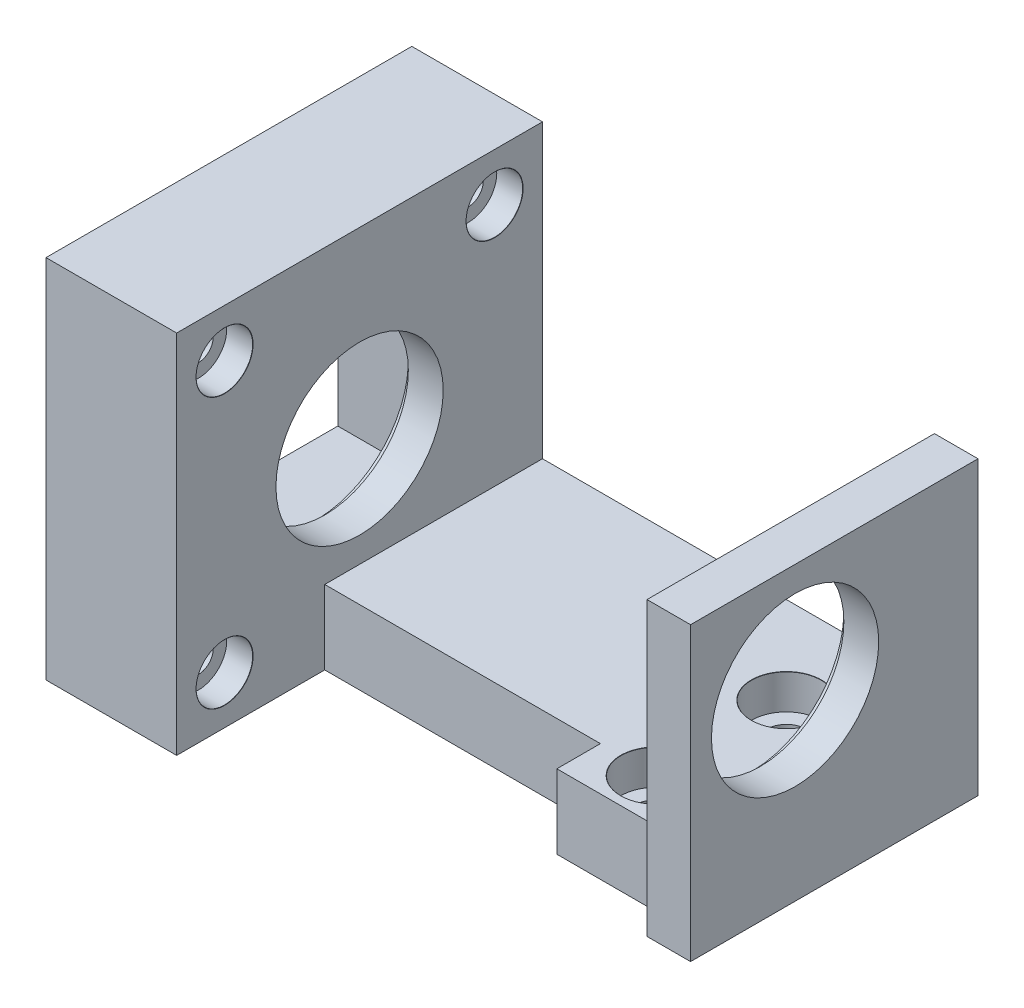
ISO-10303-21;
HEADER;
FILE_DESCRIPTION(('STEP AP214'),'2;1');
FILE_NAME('part.step','',(''),(''),'','','');
FILE_SCHEMA(('AUTOMOTIVE_DESIGN { 1 0 10303 214 1 1 1 1 }'));
ENDSEC;
DATA;
#1=APPLICATION_CONTEXT('core data for automotive mechanical design processes');
#2=APPLICATION_PROTOCOL_DEFINITION('international standard','automotive_design',2000,#1);
#3=PRODUCT_CONTEXT('',#1,'mechanical');
#4=PRODUCT('Part','Part','',(#3));
#5=PRODUCT_RELATED_PRODUCT_CATEGORY('part','',(#4));
#6=PRODUCT_DEFINITION_FORMATION('','',#4);
#7=PRODUCT_DEFINITION_CONTEXT('part definition',#1,'design');
#8=PRODUCT_DEFINITION('design','',#6,#7);
#9=PRODUCT_DEFINITION_SHAPE('','',#8);
#10=(LENGTH_UNIT() NAMED_UNIT(*) SI_UNIT(.MILLI.,.METRE.));
#11=(NAMED_UNIT(*) PLANE_ANGLE_UNIT() SI_UNIT($,.RADIAN.));
#12=(NAMED_UNIT(*) SI_UNIT($,.STERADIAN.) SOLID_ANGLE_UNIT());
#13=UNCERTAINTY_MEASURE_WITH_UNIT(LENGTH_MEASURE(1.E-05),#10,'distance_accuracy_value','');
#14=(GEOMETRIC_REPRESENTATION_CONTEXT(3) GLOBAL_UNCERTAINTY_ASSIGNED_CONTEXT((#13)) GLOBAL_UNIT_ASSIGNED_CONTEXT((#10,
#11,#12)) REPRESENTATION_CONTEXT('',''));
#15=CARTESIAN_POINT('',(0.,0.,0.));
#16=DIRECTION('',(0.,0.,1.));
#17=DIRECTION('',(1.,0.,0.));
#18=AXIS2_PLACEMENT_3D('',#15,#16,#17);
#19=CARTESIAN_POINT('',(0.,5.,0.));
#20=DIRECTION('',(0.,-1.,0.));
#21=DIRECTION('',(0.,0.,-1.));
#22=AXIS2_PLACEMENT_3D('',#19,#20,#21);
#23=PLANE('',#22);
#24=CARTESIAN_POINT('',(15.5,5.,8.5));
#25=DIRECTION('',(0.,1.,0.));
#26=DIRECTION('',(0.,0.,1.));
#27=AXIS2_PLACEMENT_3D('',#24,#25,#26);
#28=CIRCLE('',#27,4.025);
#29=CARTESIAN_POINT('',(15.5,5.,12.525));
#30=VERTEX_POINT('',#29);
#31=EDGE_CURVE('E333',#30,#30,#28,.T.);
#32=ORIENTED_EDGE('',*,*,#31,.F.);
#33=EDGE_LOOP('',(#32));
#34=FACE_BOUND('',#33,.T.);
#35=CARTESIAN_POINT('',(15.5,5.,-6.5));
#36=DIRECTION('',(0.,1.,0.));
#37=DIRECTION('',(0.,0.,1.));
#38=AXIS2_PLACEMENT_3D('',#35,#36,#37);
#39=CIRCLE('',#38,4.025);
#40=CARTESIAN_POINT('',(15.5,5.,-2.475));
#41=VERTEX_POINT('',#40);
#42=EDGE_CURVE('E348',#41,#41,#39,.T.);
#43=ORIENTED_EDGE('',*,*,#42,.F.);
#44=EDGE_LOOP('',(#43));
#45=FACE_BOUND('',#44,.T.);
#46=DIRECTION('',(0.,0.,1.));
#47=VECTOR('',#46,1.);
#48=CARTESIAN_POINT('',(22.5,5.,-7.5));
#49=LINE('',#48,#47);
#50=CARTESIAN_POINT('',(22.5,5.,-16.5));
#51=VERTEX_POINT('',#50);
#52=CARTESIAN_POINT('',(22.5,5.,13.5));
#53=VERTEX_POINT('',#52);
#54=EDGE_CURVE('E152',#51,#53,#49,.T.);
#55=ORIENTED_EDGE('',*,*,#54,.F.);
#56=DIRECTION('',(-1.,0.,0.));
#57=VECTOR('',#56,1.);
#58=CARTESIAN_POINT('',(-27.5,5.,-16.5));
#59=LINE('',#58,#57);
#60=CARTESIAN_POINT('',(-22.5,5.,-16.5));
#61=VERTEX_POINT('',#60);
#62=EDGE_CURVE('E156',#51,#61,#59,.T.);
#63=ORIENTED_EDGE('',*,*,#62,.T.);
#64=DIRECTION('',(0.,0.,-1.));
#65=VECTOR('',#64,1.);
#66=CARTESIAN_POINT('',(-22.5,5.,-7.5));
#67=LINE('',#66,#65);
#68=CARTESIAN_POINT('',(-22.5,5.,8.5));
#69=VERTEX_POINT('',#68);
#70=EDGE_CURVE('E162',#69,#61,#67,.T.);
#71=ORIENTED_EDGE('',*,*,#70,.F.);
#72=DIRECTION('',(-1.,0.,0.));
#73=VECTOR('',#72,1.);
#74=CARTESIAN_POINT('',(-22.5,5.,8.5));
#75=LINE('',#74,#73);
#76=CARTESIAN_POINT('',(9.15000000000001,5.,8.5));
#77=VERTEX_POINT('',#76);
#78=EDGE_CURVE('E360',#77,#69,#75,.T.);
#79=ORIENTED_EDGE('',*,*,#78,.F.);
#80=DIRECTION('',(0.,0.,-1.));
#81=VECTOR('',#80,1.);
#82=CARTESIAN_POINT('',(9.15000000000001,5.,8.5));
#83=LINE('',#82,#81);
#84=CARTESIAN_POINT('',(9.15000000000001,5.,13.5));
#85=VERTEX_POINT('',#84);
#86=EDGE_CURVE('E364',#85,#77,#83,.T.);
#87=ORIENTED_EDGE('',*,*,#86,.F.);
#88=DIRECTION('',(-1.,0.,0.));
#89=VECTOR('',#88,1.);
#90=CARTESIAN_POINT('',(9.15000000000001,5.,13.5));
#91=LINE('',#90,#89);
#92=EDGE_CURVE('E160',#53,#85,#91,.T.);
#93=ORIENTED_EDGE('',*,*,#92,.F.);
#94=EDGE_LOOP('',(#55,#63,#71,#79,#87,#93));
#95=FACE_BOUND('',#94,.T.);
#96=ADVANCED_FACE('F39',(#34,#45,#95),#23,.F.);
#97=CARTESIAN_POINT('',(-22.5,30.,-7.5));
#98=DIRECTION('',(-1.,0.,0.));
#99=DIRECTION('',(0.,0.,1.));
#100=AXIS2_PLACEMENT_3D('',#97,#98,#99);
#101=PLANE('',#100);
#102=DIRECTION('',(0.,1.,0.));
#103=VECTOR('',#102,1.);
#104=CARTESIAN_POINT('',(-22.5,-3.50000000000001,8.5));
#105=LINE('',#104,#103);
#106=CARTESIAN_POINT('',(-22.5,-3.50000000000001,8.5));
#107=VERTEX_POINT('',#106);
#108=EDGE_CURVE('E351',#107,#69,#105,.T.);
#109=ORIENTED_EDGE('',*,*,#108,.T.);
#110=ORIENTED_EDGE('',*,*,#70,.T.);
#111=DIRECTION('',(0.,1.,0.));
#112=VECTOR('',#111,1.);
#113=CARTESIAN_POINT('',(-22.5,5.,-16.5));
#114=LINE('',#113,#112);
#115=CARTESIAN_POINT('',(-22.5,38.5,-16.5));
#116=VERTEX_POINT('',#115);
#117=EDGE_CURVE('E178',#61,#116,#114,.T.);
#118=ORIENTED_EDGE('',*,*,#117,.T.);
#119=DIRECTION('',(0.,0.,1.));
#120=VECTOR('',#119,1.);
#121=CARTESIAN_POINT('',(-22.5,38.5,-16.5));
#122=LINE('',#121,#120);
#123=CARTESIAN_POINT('',(-22.5,38.5,25.5));
#124=VERTEX_POINT('',#123);
#125=EDGE_CURVE('E214',#116,#124,#122,.T.);
#126=ORIENTED_EDGE('',*,*,#125,.T.);
#127=DIRECTION('',(0.,-1.,0.));
#128=VECTOR('',#127,1.);
#129=CARTESIAN_POINT('',(-22.5,38.5,25.5));
#130=LINE('',#129,#128);
#131=CARTESIAN_POINT('',(-22.5,-3.50000000000001,25.5));
#132=VERTEX_POINT('',#131);
#133=EDGE_CURVE('E216',#124,#132,#130,.T.);
#134=ORIENTED_EDGE('',*,*,#133,.T.);
#135=DIRECTION('',(0.,0.,-1.));
#136=VECTOR('',#135,1.);
#137=CARTESIAN_POINT('',(-22.5,-3.50000000000001,25.5));
#138=LINE('',#137,#136);
#139=EDGE_CURVE('E227',#132,#107,#138,.T.);
#140=ORIENTED_EDGE('',*,*,#139,.T.);
#141=EDGE_LOOP('',(#109,#110,#118,#126,#134,#140));
#142=FACE_BOUND('',#141,.T.);
#143=CARTESIAN_POINT('',(-22.5,17.5,4.5));
#144=DIRECTION('',(-1.,0.,0.));
#145=DIRECTION('',(0.,0.,1.));
#146=AXIS2_PLACEMENT_3D('',#143,#144,#145);
#147=CIRCLE('',#146,9.60000000000001);
#148=CARTESIAN_POINT('',(-22.5,17.5,14.1));
#149=VERTEX_POINT('',#148);
#150=EDGE_CURVE('E190',#149,#149,#147,.T.);
#151=ORIENTED_EDGE('',*,*,#150,.T.);
#152=EDGE_LOOP('',(#151));
#153=FACE_BOUND('',#152,.T.);
#154=CARTESIAN_POINT('',(-22.5,1.99999999999999,20.));
#155=DIRECTION('',(1.,0.,0.));
#156=DIRECTION('',(0.,0.,-1.));
#157=AXIS2_PLACEMENT_3D('',#154,#155,#156);
#158=CIRCLE('',#157,3.275);
#159=CARTESIAN_POINT('',(-22.5,1.99999999999999,16.725));
#160=VERTEX_POINT('',#159);
#161=EDGE_CURVE('E282',#160,#160,#158,.T.);
#162=ORIENTED_EDGE('',*,*,#161,.F.);
#163=EDGE_LOOP('',(#162));
#164=FACE_BOUND('',#163,.T.);
#165=CARTESIAN_POINT('',(-22.5,33.,-11.));
#166=DIRECTION('',(1.,0.,0.));
#167=DIRECTION('',(0.,0.,-1.));
#168=AXIS2_PLACEMENT_3D('',#165,#166,#167);
#169=CIRCLE('',#168,3.275);
#170=CARTESIAN_POINT('',(-22.5,33.,-14.275));
#171=VERTEX_POINT('',#170);
#172=EDGE_CURVE('E297',#171,#171,#169,.T.);
#173=ORIENTED_EDGE('',*,*,#172,.F.);
#174=EDGE_LOOP('',(#173));
#175=FACE_BOUND('',#174,.T.);
#176=CARTESIAN_POINT('',(-22.5,33.,20.));
#177=DIRECTION('',(1.,0.,0.));
#178=DIRECTION('',(0.,0.,-1.));
#179=AXIS2_PLACEMENT_3D('',#176,#177,#178);
#180=CIRCLE('',#179,3.275);
#181=CARTESIAN_POINT('',(-22.5,33.,16.725));
#182=VERTEX_POINT('',#181);
#183=EDGE_CURVE('E312',#182,#182,#180,.T.);
#184=ORIENTED_EDGE('',*,*,#183,.F.);
#185=EDGE_LOOP('',(#184));
#186=FACE_BOUND('',#185,.T.);
#187=ADVANCED_FACE('F401',(#142,#153,#164,#175,#186),#101,.F.);
#188=CARTESIAN_POINT('',(-27.5,5.,16.5));
#189=DIRECTION('',(0.,0.,-1.));
#190=DIRECTION('',(-1.,0.,0.));
#191=AXIS2_PLACEMENT_3D('',#188,#189,#190);
#192=PLANE('',#191);
#193=DIRECTION('',(0.,-1.,0.));
#194=VECTOR('',#193,1.);
#195=CARTESIAN_POINT('',(22.5,30.,16.5));
#196=LINE('',#195,#194);
#197=CARTESIAN_POINT('',(22.5,30.,16.5));
#198=VERTEX_POINT('',#197);
#199=CARTESIAN_POINT('',(22.5,-3.50000000000001,16.5));
#200=VERTEX_POINT('',#199);
#201=EDGE_CURVE('E187',#198,#200,#196,.T.);
#202=ORIENTED_EDGE('',*,*,#201,.T.);
#203=DIRECTION('',(-1.,0.,0.));
#204=VECTOR('',#203,1.);
#205=CARTESIAN_POINT('',(-22.5,-3.5,16.5));
#206=LINE('',#205,#204);
#207=CARTESIAN_POINT('',(27.5,-3.5,16.5));
#208=VERTEX_POINT('',#207);
#209=EDGE_CURVE('E316',#208,#200,#206,.T.);
#210=ORIENTED_EDGE('',*,*,#209,.F.);
#211=DIRECTION('',(0.,-1.,0.));
#212=VECTOR('',#211,1.);
#213=CARTESIAN_POINT('',(27.5,5.,16.5));
#214=LINE('',#213,#212);
#215=CARTESIAN_POINT('',(27.5,30.,16.5));
#216=VERTEX_POINT('',#215);
#217=EDGE_CURVE('E47',#216,#208,#214,.T.);
#218=ORIENTED_EDGE('',*,*,#217,.F.);
#219=DIRECTION('',(1.,0.,0.));
#220=VECTOR('',#219,1.);
#221=CARTESIAN_POINT('',(27.5,30.,16.5));
#222=LINE('',#221,#220);
#223=EDGE_CURVE('E185',#198,#216,#222,.T.);
#224=ORIENTED_EDGE('',*,*,#223,.F.);
#225=EDGE_LOOP('',(#202,#210,#218,#224));
#226=FACE_BOUND('',#225,.T.);
#227=ADVANCED_FACE('F418',(#226),#192,.F.);
#228=CARTESIAN_POINT('',(-27.5,5.,16.5));
#229=DIRECTION('',(1.,0.,0.));
#230=DIRECTION('',(0.,0.,-1.));
#231=AXIS2_PLACEMENT_3D('',#228,#229,#230);
#232=PLANE('',#231);
#233=DIRECTION('',(0.,0.,-1.));
#234=VECTOR('',#233,1.);
#235=CARTESIAN_POINT('',(-27.5,30.,-8.00000000000001));
#236=LINE('',#235,#234);
#237=CARTESIAN_POINT('',(-27.5,30.,17.));
#238=VERTEX_POINT('',#237);
#239=CARTESIAN_POINT('',(-27.5,30.,-8.00000000000001));
#240=VERTEX_POINT('',#239);
#241=EDGE_CURVE('E250',#238,#240,#236,.T.);
#242=ORIENTED_EDGE('',*,*,#241,.T.);
#243=DIRECTION('',(0.,-1.,0.));
#244=VECTOR('',#243,1.);
#245=CARTESIAN_POINT('',(-27.5,30.,-8.00000000000001));
#246=LINE('',#245,#244);
#247=CARTESIAN_POINT('',(-27.5,4.99999999999999,-8.00000000000001));
#248=VERTEX_POINT('',#247);
#249=EDGE_CURVE('E260',#240,#248,#246,.T.);
#250=ORIENTED_EDGE('',*,*,#249,.T.);
#251=DIRECTION('',(0.,0.,1.));
#252=VECTOR('',#251,1.);
#253=CARTESIAN_POINT('',(-27.5,4.99999999999999,-8.00000000000001));
#254=LINE('',#253,#252);
#255=CARTESIAN_POINT('',(-27.5,4.99999999999999,17.));
#256=VERTEX_POINT('',#255);
#257=EDGE_CURVE('E257',#248,#256,#254,.T.);
#258=ORIENTED_EDGE('',*,*,#257,.T.);
#259=DIRECTION('',(0.,1.,0.));
#260=VECTOR('',#259,1.);
#261=CARTESIAN_POINT('',(-27.5,30.,17.));
#262=LINE('',#261,#260);
#263=EDGE_CURVE('E254',#256,#238,#262,.T.);
#264=ORIENTED_EDGE('',*,*,#263,.T.);
#265=EDGE_LOOP('',(#242,#250,#258,#264));
#266=FACE_BOUND('',#265,.T.);
#267=CARTESIAN_POINT('',(-27.5,17.5,4.5));
#268=DIRECTION('',(-1.,0.,0.));
#269=DIRECTION('',(0.,0.,1.));
#270=AXIS2_PLACEMENT_3D('',#267,#268,#269);
#271=CIRCLE('',#270,10.6);
#272=CARTESIAN_POINT('',(-27.5,17.5,15.1));
#273=VERTEX_POINT('',#272);
#274=EDGE_CURVE('E199',#273,#273,#271,.T.);
#275=ORIENTED_EDGE('',*,*,#274,.F.);
#276=EDGE_LOOP('',(#275));
#277=FACE_BOUND('',#276,.T.);
#278=ADVANCED_FACE('F420',(#266,#277),#232,.F.);
#279=CARTESIAN_POINT('',(27.5,5.,16.5));
#280=DIRECTION('',(-1.,0.,0.));
#281=DIRECTION('',(0.,0.,1.));
#282=AXIS2_PLACEMENT_3D('',#279,#280,#281);
#283=PLANE('',#282);
#284=DIRECTION('',(0.,-1.,0.));
#285=VECTOR('',#284,1.);
#286=CARTESIAN_POINT('',(27.5,5.,-16.5));
#287=LINE('',#286,#285);
#288=CARTESIAN_POINT('',(27.5,30.,-16.5));
#289=VERTEX_POINT('',#288);
#290=CARTESIAN_POINT('',(27.5,-3.5,-16.5));
#291=VERTEX_POINT('',#290);
#292=EDGE_CURVE('E11',#289,#291,#287,.T.);
#293=ORIENTED_EDGE('',*,*,#292,.F.);
#294=DIRECTION('',(0.,0.,-1.));
#295=VECTOR('',#294,1.);
#296=CARTESIAN_POINT('',(27.5,30.,-7.5));
#297=LINE('',#296,#295);
#298=EDGE_CURVE('E163',#216,#289,#297,.T.);
#299=ORIENTED_EDGE('',*,*,#298,.F.);
#300=ORIENTED_EDGE('',*,*,#217,.T.);
#301=DIRECTION('',(0.,0.,1.));
#302=VECTOR('',#301,1.);
#303=CARTESIAN_POINT('',(27.5,-3.5,16.5));
#304=LINE('',#303,#302);
#305=EDGE_CURVE('E315',#291,#208,#304,.T.);
#306=ORIENTED_EDGE('',*,*,#305,.F.);
#307=EDGE_LOOP('',(#293,#299,#300,#306));
#308=FACE_BOUND('',#307,.T.);
#309=CARTESIAN_POINT('',(27.5,17.5,4.5));
#310=DIRECTION('',(-1.,0.,0.));
#311=DIRECTION('',(0.,0.,1.));
#312=AXIS2_PLACEMENT_3D('',#309,#310,#311);
#313=CIRCLE('',#312,9.60000000000001);
#314=CARTESIAN_POINT('',(27.5,17.5,14.1));
#315=VERTEX_POINT('',#314);
#316=EDGE_CURVE('E202',#315,#315,#313,.T.);
#317=ORIENTED_EDGE('',*,*,#316,.T.);
#318=EDGE_LOOP('',(#317));
#319=FACE_BOUND('',#318,.T.);
#320=ADVANCED_FACE('F41',(#308,#319),#283,.F.);
#321=CARTESIAN_POINT('',(-27.5,5.,-16.5));
#322=DIRECTION('',(0.,0.,1.));
#323=DIRECTION('',(1.,0.,0.));
#324=AXIS2_PLACEMENT_3D('',#321,#322,#323);
#325=PLANE('',#324);
#326=ORIENTED_EDGE('',*,*,#292,.T.);
#327=DIRECTION('',(-1.,0.,0.));
#328=VECTOR('',#327,1.);
#329=CARTESIAN_POINT('',(36.89696961967,-3.50000000000001,-16.5));
#330=LINE('',#329,#328);
#331=CARTESIAN_POINT('',(-37.5,-3.50000000000001,-16.5));
#332=VERTEX_POINT('',#331);
#333=EDGE_CURVE('E222',#291,#332,#330,.T.);
#334=ORIENTED_EDGE('',*,*,#333,.T.);
#335=DIRECTION('',(0.,-1.,0.));
#336=VECTOR('',#335,1.);
#337=CARTESIAN_POINT('',(-37.5,38.5,-16.5));
#338=LINE('',#337,#336);
#339=CARTESIAN_POINT('',(-37.5,38.5,-16.5));
#340=VERTEX_POINT('',#339);
#341=EDGE_CURVE('E238',#340,#332,#338,.T.);
#342=ORIENTED_EDGE('',*,*,#341,.F.);
#343=DIRECTION('',(-1.,0.,0.));
#344=VECTOR('',#343,1.);
#345=CARTESIAN_POINT('',(36.89696961967,38.5,-16.5));
#346=LINE('',#345,#344);
#347=EDGE_CURVE('E219',#116,#340,#346,.T.);
#348=ORIENTED_EDGE('',*,*,#347,.F.);
#349=ORIENTED_EDGE('',*,*,#117,.F.);
#350=ORIENTED_EDGE('',*,*,#62,.F.);
#351=DIRECTION('',(0.,-1.,0.));
#352=VECTOR('',#351,1.);
#353=CARTESIAN_POINT('',(22.5,40.295630140987,-16.5));
#354=LINE('',#353,#352);
#355=CARTESIAN_POINT('',(22.5,30.,-16.5));
#356=VERTEX_POINT('',#355);
#357=EDGE_CURVE('E166',#356,#51,#354,.T.);
#358=ORIENTED_EDGE('',*,*,#357,.F.);
#359=DIRECTION('',(1.,0.,0.));
#360=VECTOR('',#359,1.);
#361=CARTESIAN_POINT('',(27.5,30.,-16.5));
#362=LINE('',#361,#360);
#363=EDGE_CURVE('E173',#356,#289,#362,.T.);
#364=ORIENTED_EDGE('',*,*,#363,.T.);
#365=EDGE_LOOP('',(#326,#334,#342,#348,#349,#350,#358,#364));
#366=FACE_BOUND('',#365,.T.);
#367=ADVANCED_FACE('F176',(#366),#325,.F.);
#368=CARTESIAN_POINT('',(22.5,30.,-7.5));
#369=DIRECTION('',(1.,0.,0.));
#370=DIRECTION('',(0.,0.,-1.));
#371=AXIS2_PLACEMENT_3D('',#368,#369,#370);
#372=PLANE('',#371);
#373=CARTESIAN_POINT('',(22.5,17.5,4.5));
#374=DIRECTION('',(-1.,0.,0.));
#375=DIRECTION('',(0.,0.,1.));
#376=AXIS2_PLACEMENT_3D('',#373,#374,#375);
#377=CIRCLE('',#376,10.6);
#378=CARTESIAN_POINT('',(22.5,17.5,15.1));
#379=VERTEX_POINT('',#378);
#380=EDGE_CURVE('E211',#379,#379,#377,.T.);
#381=ORIENTED_EDGE('',*,*,#380,.F.);
#382=EDGE_LOOP('',(#381));
#383=FACE_BOUND('',#382,.T.);
#384=ORIENTED_EDGE('',*,*,#54,.T.);
#385=DIRECTION('',(0.,1.,0.));
#386=VECTOR('',#385,1.);
#387=CARTESIAN_POINT('',(22.5,-3.50000000000001,13.5));
#388=LINE('',#387,#386);
#389=CARTESIAN_POINT('',(22.5,-3.50000000000001,13.5));
#390=VERTEX_POINT('',#389);
#391=EDGE_CURVE('E352',#390,#53,#388,.T.);
#392=ORIENTED_EDGE('',*,*,#391,.F.);
#393=DIRECTION('',(0.,0.,-1.));
#394=VECTOR('',#393,1.);
#395=CARTESIAN_POINT('',(22.5,-3.50000000000001,16.5));
#396=LINE('',#395,#394);
#397=EDGE_CURVE('E363',#200,#390,#396,.T.);
#398=ORIENTED_EDGE('',*,*,#397,.F.);
#399=ORIENTED_EDGE('',*,*,#201,.F.);
#400=DIRECTION('',(0.,0.,1.));
#401=VECTOR('',#400,1.);
#402=CARTESIAN_POINT('',(22.5,30.,-7.5));
#403=LINE('',#402,#401);
#404=EDGE_CURVE('E169',#356,#198,#403,.T.);
#405=ORIENTED_EDGE('',*,*,#404,.F.);
#406=ORIENTED_EDGE('',*,*,#357,.T.);
#407=EDGE_LOOP('',(#384,#392,#398,#399,#405,#406));
#408=FACE_BOUND('',#407,.T.);
#409=ADVANCED_FACE('F167',(#383,#408),#372,.F.);
#410=CARTESIAN_POINT('',(0.,30.,0.));
#411=DIRECTION('',(0.,-1.,0.));
#412=DIRECTION('',(0.,0.,-1.));
#413=AXIS2_PLACEMENT_3D('',#410,#411,#412);
#414=PLANE('',#413);
#415=ORIENTED_EDGE('',*,*,#298,.T.);
#416=ORIENTED_EDGE('',*,*,#363,.F.);
#417=ORIENTED_EDGE('',*,*,#404,.T.);
#418=ORIENTED_EDGE('',*,*,#223,.T.);
#419=EDGE_LOOP('',(#415,#416,#417,#418));
#420=FACE_BOUND('',#419,.T.);
#421=ADVANCED_FACE('F378',(#420),#414,.F.);
#422=CARTESIAN_POINT('',(-27.5,17.5,4.5));
#423=DIRECTION('',(-1.,0.,0.));
#424=DIRECTION('',(0.,0.,1.));
#425=AXIS2_PLACEMENT_3D('',#422,#423,#424);
#426=CYLINDRICAL_SURFACE('',#425,9.60000000000001);
#427=ORIENTED_EDGE('',*,*,#150,.F.);
#428=EDGE_LOOP('',(#427));
#429=FACE_BOUND('',#428,.T.);
#430=CARTESIAN_POINT('',(-26.5,17.5,4.5));
#431=DIRECTION('',(-1.,0.,0.));
#432=DIRECTION('',(0.,0.,1.));
#433=AXIS2_PLACEMENT_3D('',#430,#431,#432);
#434=CIRCLE('',#433,9.60000000000001);
#435=CARTESIAN_POINT('',(-26.5,17.5,14.1));
#436=VERTEX_POINT('',#435);
#437=EDGE_CURVE('E193',#436,#436,#434,.T.);
#438=ORIENTED_EDGE('',*,*,#437,.T.);
#439=EDGE_LOOP('',(#438));
#440=FACE_BOUND('',#439,.T.);
#441=ADVANCED_FACE('F442',(#429,#440),#426,.F.);
#442=CARTESIAN_POINT('',(-26.5,27.1,4.5));
#443=DIRECTION('',(1.,0.,0.));
#444=DIRECTION('',(0.,0.,-1.));
#445=AXIS2_PLACEMENT_3D('',#442,#443,#444);
#446=PLANE('',#445);
#447=ORIENTED_EDGE('',*,*,#437,.F.);
#448=EDGE_LOOP('',(#447));
#449=FACE_BOUND('',#448,.T.);
#450=CARTESIAN_POINT('',(-26.5,17.5,4.5));
#451=DIRECTION('',(-1.,0.,0.));
#452=DIRECTION('',(0.,0.,1.));
#453=AXIS2_PLACEMENT_3D('',#450,#451,#452);
#454=CIRCLE('',#453,10.6);
#455=CARTESIAN_POINT('',(-26.5,17.5,15.1));
#456=VERTEX_POINT('',#455);
#457=EDGE_CURVE('E196',#456,#456,#454,.T.);
#458=ORIENTED_EDGE('',*,*,#457,.T.);
#459=EDGE_LOOP('',(#458));
#460=FACE_BOUND('',#459,.T.);
#461=ADVANCED_FACE('F448',(#449,#460),#446,.F.);
#462=CARTESIAN_POINT('',(-27.5,17.5,4.5));
#463=DIRECTION('',(-1.,0.,0.));
#464=DIRECTION('',(0.,0.,1.));
#465=AXIS2_PLACEMENT_3D('',#462,#463,#464);
#466=CYLINDRICAL_SURFACE('',#465,10.6);
#467=ORIENTED_EDGE('',*,*,#457,.F.);
#468=EDGE_LOOP('',(#467));
#469=FACE_BOUND('',#468,.T.);
#470=ORIENTED_EDGE('',*,*,#274,.T.);
#471=EDGE_LOOP('',(#470));
#472=FACE_BOUND('',#471,.T.);
#473=ADVANCED_FACE('F452',(#469,#472),#466,.F.);
#474=CARTESIAN_POINT('',(22.5,17.5,4.5));
#475=DIRECTION('',(-1.,0.,0.));
#476=DIRECTION('',(0.,0.,1.));
#477=AXIS2_PLACEMENT_3D('',#474,#475,#476);
#478=CYLINDRICAL_SURFACE('',#477,9.60000000000001);
#479=ORIENTED_EDGE('',*,*,#316,.F.);
#480=EDGE_LOOP('',(#479));
#481=FACE_BOUND('',#480,.T.);
#482=CARTESIAN_POINT('',(23.5,17.5,4.5));
#483=DIRECTION('',(-1.,0.,0.));
#484=DIRECTION('',(0.,0.,1.));
#485=AXIS2_PLACEMENT_3D('',#482,#483,#484);
#486=CIRCLE('',#485,9.60000000000001);
#487=CARTESIAN_POINT('',(23.5,17.5,14.1));
#488=VERTEX_POINT('',#487);
#489=EDGE_CURVE('E205',#488,#488,#486,.T.);
#490=ORIENTED_EDGE('',*,*,#489,.T.);
#491=EDGE_LOOP('',(#490));
#492=FACE_BOUND('',#491,.T.);
#493=ADVANCED_FACE('F456',(#481,#492),#478,.F.);
#494=CARTESIAN_POINT('',(23.5,27.1,4.5));
#495=DIRECTION('',(1.,0.,0.));
#496=DIRECTION('',(0.,0.,-1.));
#497=AXIS2_PLACEMENT_3D('',#494,#495,#496);
#498=PLANE('',#497);
#499=ORIENTED_EDGE('',*,*,#489,.F.);
#500=EDGE_LOOP('',(#499));
#501=FACE_BOUND('',#500,.T.);
#502=CARTESIAN_POINT('',(23.5,17.5,4.5));
#503=DIRECTION('',(-1.,0.,0.));
#504=DIRECTION('',(0.,0.,1.));
#505=AXIS2_PLACEMENT_3D('',#502,#503,#504);
#506=CIRCLE('',#505,10.6);
#507=CARTESIAN_POINT('',(23.5,17.5,15.1));
#508=VERTEX_POINT('',#507);
#509=EDGE_CURVE('E208',#508,#508,#506,.T.);
#510=ORIENTED_EDGE('',*,*,#509,.T.);
#511=EDGE_LOOP('',(#510));
#512=FACE_BOUND('',#511,.T.);
#513=ADVANCED_FACE('F460',(#501,#512),#498,.F.);
#514=CARTESIAN_POINT('',(22.5,17.5,4.5));
#515=DIRECTION('',(-1.,0.,0.));
#516=DIRECTION('',(0.,0.,1.));
#517=AXIS2_PLACEMENT_3D('',#514,#515,#516);
#518=CYLINDRICAL_SURFACE('',#517,10.6);
#519=ORIENTED_EDGE('',*,*,#509,.F.);
#520=EDGE_LOOP('',(#519));
#521=FACE_BOUND('',#520,.T.);
#522=ORIENTED_EDGE('',*,*,#380,.T.);
#523=EDGE_LOOP('',(#522));
#524=FACE_BOUND('',#523,.T.);
#525=ADVANCED_FACE('F464',(#521,#524),#518,.F.);
#526=CARTESIAN_POINT('',(36.89696961967,38.5,25.5));
#527=DIRECTION('',(0.,0.,1.));
#528=DIRECTION('',(0.,-1.,0.));
#529=AXIS2_PLACEMENT_3D('',#526,#527,#528);
#530=PLANE('',#529);
#531=ORIENTED_EDGE('',*,*,#133,.F.);
#532=DIRECTION('',(-1.,0.,0.));
#533=VECTOR('',#532,1.);
#534=CARTESIAN_POINT('',(36.89696961967,38.5,25.5));
#535=LINE('',#534,#533);
#536=CARTESIAN_POINT('',(-37.5,38.5,25.5));
#537=VERTEX_POINT('',#536);
#538=EDGE_CURVE('E217',#124,#537,#535,.T.);
#539=ORIENTED_EDGE('',*,*,#538,.T.);
#540=DIRECTION('',(0.,1.,0.));
#541=VECTOR('',#540,1.);
#542=CARTESIAN_POINT('',(-37.5,38.5,25.5));
#543=LINE('',#542,#541);
#544=CARTESIAN_POINT('',(-37.5,-3.50000000000001,25.5));
#545=VERTEX_POINT('',#544);
#546=EDGE_CURVE('E232',#545,#537,#543,.T.);
#547=ORIENTED_EDGE('',*,*,#546,.F.);
#548=DIRECTION('',(-1.,0.,0.));
#549=VECTOR('',#548,1.);
#550=CARTESIAN_POINT('',(36.89696961967,-3.50000000000001,25.5));
#551=LINE('',#550,#549);
#552=EDGE_CURVE('E224',#132,#545,#551,.T.);
#553=ORIENTED_EDGE('',*,*,#552,.F.);
#554=EDGE_LOOP('',(#531,#539,#547,#553));
#555=FACE_BOUND('',#554,.T.);
#556=ADVANCED_FACE('F406',(#555),#530,.T.);
#557=CARTESIAN_POINT('',(36.89696961967,-3.50000000000001,25.5));
#558=DIRECTION('',(0.,-1.,0.));
#559=DIRECTION('',(0.,0.,-1.));
#560=AXIS2_PLACEMENT_3D('',#557,#558,#559);
#561=PLANE('',#560);
#562=DIRECTION('',(-1.,0.,0.));
#563=VECTOR('',#562,1.);
#564=CARTESIAN_POINT('',(-22.5,-3.50000000000001,8.5));
#565=LINE('',#564,#563);
#566=CARTESIAN_POINT('',(9.15000000000001,-3.50000000000001,8.5));
#567=VERTEX_POINT('',#566);
#568=EDGE_CURVE('E355',#567,#107,#565,.T.);
#569=ORIENTED_EDGE('',*,*,#568,.T.);
#570=ORIENTED_EDGE('',*,*,#139,.F.);
#571=ORIENTED_EDGE('',*,*,#552,.T.);
#572=DIRECTION('',(0.,0.,1.));
#573=VECTOR('',#572,1.);
#574=CARTESIAN_POINT('',(-37.5,-3.50000000000001,-16.5));
#575=LINE('',#574,#573);
#576=EDGE_CURVE('E235',#332,#545,#575,.T.);
#577=ORIENTED_EDGE('',*,*,#576,.F.);
#578=ORIENTED_EDGE('',*,*,#333,.F.);
#579=ORIENTED_EDGE('',*,*,#305,.T.);
#580=ORIENTED_EDGE('',*,*,#209,.T.);
#581=ORIENTED_EDGE('',*,*,#397,.T.);
#582=DIRECTION('',(-1.,0.,0.));
#583=VECTOR('',#582,1.);
#584=CARTESIAN_POINT('',(9.15000000000001,-3.50000000000001,13.5));
#585=LINE('',#584,#583);
#586=CARTESIAN_POINT('',(9.15000000000001,-3.50000000000001,13.5));
#587=VERTEX_POINT('',#586);
#588=EDGE_CURVE('E54',#390,#587,#585,.T.);
#589=ORIENTED_EDGE('',*,*,#588,.T.);
#590=DIRECTION('',(0.,0.,-1.));
#591=VECTOR('',#590,1.);
#592=CARTESIAN_POINT('',(9.15000000000001,-3.50000000000001,8.5));
#593=LINE('',#592,#591);
#594=EDGE_CURVE('E370',#587,#567,#593,.T.);
#595=ORIENTED_EDGE('',*,*,#594,.T.);
#596=EDGE_LOOP('',(#569,#570,#571,#577,#578,#579,#580,#581,#589,#595));
#597=FACE_BOUND('',#596,.T.);
#598=CARTESIAN_POINT('',(15.5,-3.50000000000001,-6.5));
#599=DIRECTION('',(0.,1.,0.));
#600=DIRECTION('',(0.,0.,1.));
#601=AXIS2_PLACEMENT_3D('',#598,#599,#600);
#602=CIRCLE('',#601,2.25);
#603=CARTESIAN_POINT('',(15.5,-3.50000000000001,-4.25));
#604=VERTEX_POINT('',#603);
#605=EDGE_CURVE('E336',#604,#604,#602,.T.);
#606=ORIENTED_EDGE('',*,*,#605,.T.);
#607=EDGE_LOOP('',(#606));
#608=FACE_BOUND('',#607,.T.);
#609=CARTESIAN_POINT('',(15.5,-3.50000000000001,8.5));
#610=DIRECTION('',(0.,1.,0.));
#611=DIRECTION('',(0.,0.,1.));
#612=AXIS2_PLACEMENT_3D('',#609,#610,#611);
#613=CIRCLE('',#612,2.25);
#614=CARTESIAN_POINT('',(15.5,-3.50000000000001,10.75));
#615=VERTEX_POINT('',#614);
#616=EDGE_CURVE('E319',#615,#615,#613,.T.);
#617=ORIENTED_EDGE('',*,*,#616,.T.);
#618=EDGE_LOOP('',(#617));
#619=FACE_BOUND('',#618,.T.);
#620=ADVANCED_FACE('F386',(#597,#608,#619),#561,.T.);
#621=CARTESIAN_POINT('',(36.89696961967,38.5,-16.5));
#622=DIRECTION('',(0.,1.,0.));
#623=DIRECTION('',(0.,0.,1.));
#624=AXIS2_PLACEMENT_3D('',#621,#622,#623);
#625=PLANE('',#624);
#626=ORIENTED_EDGE('',*,*,#125,.F.);
#627=ORIENTED_EDGE('',*,*,#347,.T.);
#628=DIRECTION('',(0.,0.,-1.));
#629=VECTOR('',#628,1.);
#630=CARTESIAN_POINT('',(-37.5,38.5,-16.5));
#631=LINE('',#630,#629);
#632=EDGE_CURVE('E220',#537,#340,#631,.T.);
#633=ORIENTED_EDGE('',*,*,#632,.F.);
#634=ORIENTED_EDGE('',*,*,#538,.F.);
#635=EDGE_LOOP('',(#626,#627,#633,#634));
#636=FACE_BOUND('',#635,.T.);
#637=ADVANCED_FACE('F398',(#636),#625,.T.);
#638=CARTESIAN_POINT('',(-37.5,0.,0.));
#639=DIRECTION('',(-1.,0.,0.));
#640=DIRECTION('',(0.,0.,1.));
#641=AXIS2_PLACEMENT_3D('',#638,#639,#640);
#642=PLANE('',#641);
#643=CARTESIAN_POINT('',(-37.5,33.,20.));
#644=DIRECTION('',(1.,0.,0.));
#645=DIRECTION('',(0.,0.,-1.));
#646=AXIS2_PLACEMENT_3D('',#643,#644,#645);
#647=CIRCLE('',#646,1.69999999999999);
#648=CARTESIAN_POINT('',(-37.5,33.,18.3));
#649=VERTEX_POINT('',#648);
#650=EDGE_CURVE('E300',#649,#649,#647,.T.);
#651=ORIENTED_EDGE('',*,*,#650,.T.);
#652=EDGE_LOOP('',(#651));
#653=FACE_BOUND('',#652,.T.);
#654=CARTESIAN_POINT('',(-37.5,33.,-11.));
#655=DIRECTION('',(1.,0.,0.));
#656=DIRECTION('',(0.,0.,-1.));
#657=AXIS2_PLACEMENT_3D('',#654,#655,#656);
#658=CIRCLE('',#657,1.69999999999999);
#659=CARTESIAN_POINT('',(-37.5,33.,-12.7));
#660=VERTEX_POINT('',#659);
#661=EDGE_CURVE('E285',#660,#660,#658,.T.);
#662=ORIENTED_EDGE('',*,*,#661,.T.);
#663=EDGE_LOOP('',(#662));
#664=FACE_BOUND('',#663,.T.);
#665=CARTESIAN_POINT('',(-37.5,1.99999999999999,20.));
#666=DIRECTION('',(1.,0.,0.));
#667=DIRECTION('',(0.,0.,-1.));
#668=AXIS2_PLACEMENT_3D('',#665,#666,#667);
#669=CIRCLE('',#668,1.69999999999999);
#670=CARTESIAN_POINT('',(-37.5,1.99999999999999,18.3));
#671=VERTEX_POINT('',#670);
#672=EDGE_CURVE('E263',#671,#671,#669,.T.);
#673=ORIENTED_EDGE('',*,*,#672,.T.);
#674=EDGE_LOOP('',(#673));
#675=FACE_BOUND('',#674,.T.);
#676=ORIENTED_EDGE('',*,*,#341,.T.);
#677=ORIENTED_EDGE('',*,*,#576,.T.);
#678=ORIENTED_EDGE('',*,*,#546,.T.);
#679=ORIENTED_EDGE('',*,*,#632,.T.);
#680=EDGE_LOOP('',(#676,#677,#678,#679));
#681=FACE_BOUND('',#680,.T.);
#682=DIRECTION('',(0.,0.,1.));
#683=VECTOR('',#682,1.);
#684=CARTESIAN_POINT('',(-37.5,4.99999999999999,-8.00000000000001));
#685=LINE('',#684,#683);
#686=CARTESIAN_POINT('',(-37.5,4.99999999999999,-8.00000000000001));
#687=VERTEX_POINT('',#686);
#688=CARTESIAN_POINT('',(-37.5,4.99999999999999,17.));
#689=VERTEX_POINT('',#688);
#690=EDGE_CURVE('E268',#687,#689,#685,.T.);
#691=ORIENTED_EDGE('',*,*,#690,.F.);
#692=DIRECTION('',(0.,-1.,0.));
#693=VECTOR('',#692,1.);
#694=CARTESIAN_POINT('',(-37.5,30.,-8.00000000000001));
#695=LINE('',#694,#693);
#696=CARTESIAN_POINT('',(-37.5,30.,-8.00000000000001));
#697=VERTEX_POINT('',#696);
#698=EDGE_CURVE('E253',#697,#687,#695,.T.);
#699=ORIENTED_EDGE('',*,*,#698,.F.);
#700=DIRECTION('',(0.,0.,-1.));
#701=VECTOR('',#700,1.);
#702=CARTESIAN_POINT('',(-37.5,30.,-8.00000000000001));
#703=LINE('',#702,#701);
#704=CARTESIAN_POINT('',(-37.5,30.,17.));
#705=VERTEX_POINT('',#704);
#706=EDGE_CURVE('E249',#705,#697,#703,.T.);
#707=ORIENTED_EDGE('',*,*,#706,.F.);
#708=DIRECTION('',(0.,1.,0.));
#709=VECTOR('',#708,1.);
#710=CARTESIAN_POINT('',(-37.5,30.,17.));
#711=LINE('',#710,#709);
#712=EDGE_CURVE('E265',#689,#705,#711,.T.);
#713=ORIENTED_EDGE('',*,*,#712,.F.);
#714=EDGE_LOOP('',(#691,#699,#707,#713));
#715=FACE_BOUND('',#714,.T.);
#716=ADVANCED_FACE('F392',(#653,#664,#675,#681,#715),#642,.T.);
#717=CARTESIAN_POINT('',(-37.5,30.,-8.00000000000001));
#718=DIRECTION('',(0.,0.,1.));
#719=DIRECTION('',(0.,-1.,0.));
#720=AXIS2_PLACEMENT_3D('',#717,#718,#719);
#721=PLANE('',#720);
#722=ORIENTED_EDGE('',*,*,#249,.F.);
#723=DIRECTION('',(1.,0.,0.));
#724=VECTOR('',#723,1.);
#725=CARTESIAN_POINT('',(-37.5,30.,-8.00000000000001));
#726=LINE('',#725,#724);
#727=EDGE_CURVE('E62',#697,#240,#726,.T.);
#728=ORIENTED_EDGE('',*,*,#727,.F.);
#729=ORIENTED_EDGE('',*,*,#698,.T.);
#730=DIRECTION('',(1.,0.,0.));
#731=VECTOR('',#730,1.);
#732=CARTESIAN_POINT('',(-37.5,4.99999999999999,-8.00000000000001));
#733=LINE('',#732,#731);
#734=EDGE_CURVE('E241',#687,#248,#733,.T.);
#735=ORIENTED_EDGE('',*,*,#734,.T.);
#736=EDGE_LOOP('',(#722,#728,#729,#735));
#737=FACE_BOUND('',#736,.T.);
#738=ADVANCED_FACE('F476',(#737),#721,.T.);
#739=CARTESIAN_POINT('',(-37.5,4.99999999999999,-8.00000000000001));
#740=DIRECTION('',(0.,1.,0.));
#741=DIRECTION('',(0.,0.,1.));
#742=AXIS2_PLACEMENT_3D('',#739,#740,#741);
#743=PLANE('',#742);
#744=ORIENTED_EDGE('',*,*,#257,.F.);
#745=ORIENTED_EDGE('',*,*,#734,.F.);
#746=ORIENTED_EDGE('',*,*,#690,.T.);
#747=DIRECTION('',(1.,0.,0.));
#748=VECTOR('',#747,1.);
#749=CARTESIAN_POINT('',(-37.5,4.99999999999999,17.));
#750=LINE('',#749,#748);
#751=EDGE_CURVE('E244',#689,#256,#750,.T.);
#752=ORIENTED_EDGE('',*,*,#751,.T.);
#753=EDGE_LOOP('',(#744,#745,#746,#752));
#754=FACE_BOUND('',#753,.T.);
#755=ADVANCED_FACE('F480',(#754),#743,.T.);
#756=CARTESIAN_POINT('',(-37.5,30.,17.));
#757=DIRECTION('',(0.,0.,-1.));
#758=DIRECTION('',(0.,1.,0.));
#759=AXIS2_PLACEMENT_3D('',#756,#757,#758);
#760=PLANE('',#759);
#761=ORIENTED_EDGE('',*,*,#263,.F.);
#762=ORIENTED_EDGE('',*,*,#751,.F.);
#763=ORIENTED_EDGE('',*,*,#712,.T.);
#764=DIRECTION('',(1.,0.,0.));
#765=VECTOR('',#764,1.);
#766=CARTESIAN_POINT('',(-37.5,30.,17.));
#767=LINE('',#766,#765);
#768=EDGE_CURVE('E246',#705,#238,#767,.T.);
#769=ORIENTED_EDGE('',*,*,#768,.T.);
#770=EDGE_LOOP('',(#761,#762,#763,#769));
#771=FACE_BOUND('',#770,.T.);
#772=ADVANCED_FACE('F484',(#771),#760,.T.);
#773=CARTESIAN_POINT('',(-37.5,30.,-8.00000000000001));
#774=DIRECTION('',(0.,-1.,0.));
#775=DIRECTION('',(0.,0.,-1.));
#776=AXIS2_PLACEMENT_3D('',#773,#774,#775);
#777=PLANE('',#776);
#778=ORIENTED_EDGE('',*,*,#241,.F.);
#779=ORIENTED_EDGE('',*,*,#768,.F.);
#780=ORIENTED_EDGE('',*,*,#706,.T.);
#781=ORIENTED_EDGE('',*,*,#727,.T.);
#782=EDGE_LOOP('',(#778,#779,#780,#781));
#783=FACE_BOUND('',#782,.T.);
#784=ADVANCED_FACE('F488',(#783),#777,.T.);
#785=CARTESIAN_POINT('',(-22.5,1.99999999999999,20.));
#786=DIRECTION('',(1.,0.,0.));
#787=DIRECTION('',(0.,0.,-1.));
#788=AXIS2_PLACEMENT_3D('',#785,#786,#787);
#789=CYLINDRICAL_SURFACE('',#788,1.7);
#790=ORIENTED_EDGE('',*,*,#672,.F.);
#791=EDGE_LOOP('',(#790));
#792=FACE_BOUND('',#791,.T.);
#793=CARTESIAN_POINT('',(-25.5,1.99999999999999,20.));
#794=DIRECTION('',(1.,0.,0.));
#795=DIRECTION('',(0.,0.,-1.));
#796=AXIS2_PLACEMENT_3D('',#793,#794,#795);
#797=CIRCLE('',#796,1.7);
#798=CARTESIAN_POINT('',(-25.5,1.99999999999999,18.3));
#799=VERTEX_POINT('',#798);
#800=EDGE_CURVE('E273',#799,#799,#797,.T.);
#801=ORIENTED_EDGE('',*,*,#800,.T.);
#802=EDGE_LOOP('',(#801));
#803=FACE_BOUND('',#802,.T.);
#804=ADVANCED_FACE('F492',(#792,#803),#789,.F.);
#805=CARTESIAN_POINT('',(-25.5,5.24999999999999,20.));
#806=DIRECTION('',(-1.,0.,0.));
#807=DIRECTION('',(0.,0.,1.));
#808=AXIS2_PLACEMENT_3D('',#805,#806,#807);
#809=PLANE('',#808);
#810=ORIENTED_EDGE('',*,*,#800,.F.);
#811=EDGE_LOOP('',(#810));
#812=FACE_BOUND('',#811,.T.);
#813=CARTESIAN_POINT('',(-25.5,1.99999999999999,20.));
#814=DIRECTION('',(1.,0.,0.));
#815=DIRECTION('',(0.,0.,-1.));
#816=AXIS2_PLACEMENT_3D('',#813,#814,#815);
#817=CIRCLE('',#816,3.25);
#818=CARTESIAN_POINT('',(-25.5,1.99999999999999,16.75));
#819=VERTEX_POINT('',#818);
#820=EDGE_CURVE('E276',#819,#819,#817,.T.);
#821=ORIENTED_EDGE('',*,*,#820,.T.);
#822=EDGE_LOOP('',(#821));
#823=FACE_BOUND('',#822,.T.);
#824=ADVANCED_FACE('F495',(#812,#823),#809,.F.);
#825=CARTESIAN_POINT('',(-22.5,1.99999999999999,20.));
#826=DIRECTION('',(1.,0.,0.));
#827=DIRECTION('',(0.,0.,-1.));
#828=AXIS2_PLACEMENT_3D('',#825,#826,#827);
#829=CYLINDRICAL_SURFACE('',#828,3.25);
#830=ORIENTED_EDGE('',*,*,#820,.F.);
#831=EDGE_LOOP('',(#830));
#832=FACE_BOUND('',#831,.T.);
#833=CARTESIAN_POINT('',(-22.5209774907794,1.99999999999999,20.));
#834=DIRECTION('',(1.,0.,0.));
#835=DIRECTION('',(0.,0.,-1.));
#836=AXIS2_PLACEMENT_3D('',#833,#834,#835);
#837=CIRCLE('',#836,3.25);
#838=CARTESIAN_POINT('',(-22.5209774907794,1.99999999999999,16.75));
#839=VERTEX_POINT('',#838);
#840=EDGE_CURVE('E279',#839,#839,#837,.T.);
#841=ORIENTED_EDGE('',*,*,#840,.T.);
#842=EDGE_LOOP('',(#841));
#843=FACE_BOUND('',#842,.T.);
#844=ADVANCED_FACE('F499',(#832,#843),#829,.F.);
#845=CARTESIAN_POINT('',(-22.5,1.99999999999999,20.));
#846=DIRECTION('',(1.,0.,0.));
#847=DIRECTION('',(0.,0.,-1.));
#848=AXIS2_PLACEMENT_3D('',#845,#846,#847);
#849=CONICAL_SURFACE('',#848,3.275,0.872664625997159);
#850=ORIENTED_EDGE('',*,*,#840,.F.);
#851=EDGE_LOOP('',(#850));
#852=FACE_BOUND('',#851,.T.);
#853=ORIENTED_EDGE('',*,*,#161,.T.);
#854=EDGE_LOOP('',(#853));
#855=FACE_BOUND('',#854,.T.);
#856=ADVANCED_FACE('F503',(#852,#855),#849,.F.);
#857=CARTESIAN_POINT('',(-22.5,33.,-11.));
#858=DIRECTION('',(1.,0.,0.));
#859=DIRECTION('',(0.,0.,-1.));
#860=AXIS2_PLACEMENT_3D('',#857,#858,#859);
#861=CYLINDRICAL_SURFACE('',#860,1.7);
#862=ORIENTED_EDGE('',*,*,#661,.F.);
#863=EDGE_LOOP('',(#862));
#864=FACE_BOUND('',#863,.T.);
#865=CARTESIAN_POINT('',(-25.5,33.,-11.));
#866=DIRECTION('',(1.,0.,0.));
#867=DIRECTION('',(0.,0.,-1.));
#868=AXIS2_PLACEMENT_3D('',#865,#866,#867);
#869=CIRCLE('',#868,1.7);
#870=CARTESIAN_POINT('',(-25.5,33.,-12.7));
#871=VERTEX_POINT('',#870);
#872=EDGE_CURVE('E288',#871,#871,#869,.T.);
#873=ORIENTED_EDGE('',*,*,#872,.T.);
#874=EDGE_LOOP('',(#873));
#875=FACE_BOUND('',#874,.T.);
#876=ADVANCED_FACE('F507',(#864,#875),#861,.F.);
#877=CARTESIAN_POINT('',(-25.5,36.25,-11.));
#878=DIRECTION('',(-1.,0.,0.));
#879=DIRECTION('',(0.,0.,1.));
#880=AXIS2_PLACEMENT_3D('',#877,#878,#879);
#881=PLANE('',#880);
#882=ORIENTED_EDGE('',*,*,#872,.F.);
#883=EDGE_LOOP('',(#882));
#884=FACE_BOUND('',#883,.T.);
#885=CARTESIAN_POINT('',(-25.5,33.,-11.));
#886=DIRECTION('',(1.,0.,0.));
#887=DIRECTION('',(0.,0.,-1.));
#888=AXIS2_PLACEMENT_3D('',#885,#886,#887);
#889=CIRCLE('',#888,3.25);
#890=CARTESIAN_POINT('',(-25.5,33.,-14.25));
#891=VERTEX_POINT('',#890);
#892=EDGE_CURVE('E291',#891,#891,#889,.T.);
#893=ORIENTED_EDGE('',*,*,#892,.T.);
#894=EDGE_LOOP('',(#893));
#895=FACE_BOUND('',#894,.T.);
#896=ADVANCED_FACE('F511',(#884,#895),#881,.F.);
#897=CARTESIAN_POINT('',(-22.5,33.,-11.));
#898=DIRECTION('',(1.,0.,0.));
#899=DIRECTION('',(0.,0.,-1.));
#900=AXIS2_PLACEMENT_3D('',#897,#898,#899);
#901=CYLINDRICAL_SURFACE('',#900,3.25);
#902=ORIENTED_EDGE('',*,*,#892,.F.);
#903=EDGE_LOOP('',(#902));
#904=FACE_BOUND('',#903,.T.);
#905=CARTESIAN_POINT('',(-22.5209774907794,33.,-11.));
#906=DIRECTION('',(1.,0.,0.));
#907=DIRECTION('',(0.,0.,-1.));
#908=AXIS2_PLACEMENT_3D('',#905,#906,#907);
#909=CIRCLE('',#908,3.25);
#910=CARTESIAN_POINT('',(-22.5209774907794,33.,-14.25));
#911=VERTEX_POINT('',#910);
#912=EDGE_CURVE('E294',#911,#911,#909,.T.);
#913=ORIENTED_EDGE('',*,*,#912,.T.);
#914=EDGE_LOOP('',(#913));
#915=FACE_BOUND('',#914,.T.);
#916=ADVANCED_FACE('F515',(#904,#915),#901,.F.);
#917=CARTESIAN_POINT('',(-22.5,33.,-11.));
#918=DIRECTION('',(1.,0.,0.));
#919=DIRECTION('',(0.,0.,-1.));
#920=AXIS2_PLACEMENT_3D('',#917,#918,#919);
#921=CONICAL_SURFACE('',#920,3.275,0.872664625997227);
#922=ORIENTED_EDGE('',*,*,#912,.F.);
#923=EDGE_LOOP('',(#922));
#924=FACE_BOUND('',#923,.T.);
#925=ORIENTED_EDGE('',*,*,#172,.T.);
#926=EDGE_LOOP('',(#925));
#927=FACE_BOUND('',#926,.T.);
#928=ADVANCED_FACE('F519',(#924,#927),#921,.F.);
#929=CARTESIAN_POINT('',(-22.5,33.,20.));
#930=DIRECTION('',(1.,0.,0.));
#931=DIRECTION('',(0.,0.,-1.));
#932=AXIS2_PLACEMENT_3D('',#929,#930,#931);
#933=CYLINDRICAL_SURFACE('',#932,1.7);
#934=ORIENTED_EDGE('',*,*,#650,.F.);
#935=EDGE_LOOP('',(#934));
#936=FACE_BOUND('',#935,.T.);
#937=CARTESIAN_POINT('',(-25.5,33.,20.));
#938=DIRECTION('',(1.,0.,0.));
#939=DIRECTION('',(0.,0.,-1.));
#940=AXIS2_PLACEMENT_3D('',#937,#938,#939);
#941=CIRCLE('',#940,1.7);
#942=CARTESIAN_POINT('',(-25.5,33.,18.3));
#943=VERTEX_POINT('',#942);
#944=EDGE_CURVE('E303',#943,#943,#941,.T.);
#945=ORIENTED_EDGE('',*,*,#944,.T.);
#946=EDGE_LOOP('',(#945));
#947=FACE_BOUND('',#946,.T.);
#948=ADVANCED_FACE('F523',(#936,#947),#933,.F.);
#949=CARTESIAN_POINT('',(-25.5,36.25,20.));
#950=DIRECTION('',(-1.,0.,0.));
#951=DIRECTION('',(0.,0.,1.));
#952=AXIS2_PLACEMENT_3D('',#949,#950,#951);
#953=PLANE('',#952);
#954=ORIENTED_EDGE('',*,*,#944,.F.);
#955=EDGE_LOOP('',(#954));
#956=FACE_BOUND('',#955,.T.);
#957=CARTESIAN_POINT('',(-25.5,33.,20.));
#958=DIRECTION('',(1.,0.,0.));
#959=DIRECTION('',(0.,0.,-1.));
#960=AXIS2_PLACEMENT_3D('',#957,#958,#959);
#961=CIRCLE('',#960,3.25);
#962=CARTESIAN_POINT('',(-25.5,33.,16.75));
#963=VERTEX_POINT('',#962);
#964=EDGE_CURVE('E306',#963,#963,#961,.T.);
#965=ORIENTED_EDGE('',*,*,#964,.T.);
#966=EDGE_LOOP('',(#965));
#967=FACE_BOUND('',#966,.T.);
#968=ADVANCED_FACE('F527',(#956,#967),#953,.F.);
#969=CARTESIAN_POINT('',(-22.5,33.,20.));
#970=DIRECTION('',(1.,0.,0.));
#971=DIRECTION('',(0.,0.,-1.));
#972=AXIS2_PLACEMENT_3D('',#969,#970,#971);
#973=CYLINDRICAL_SURFACE('',#972,3.25);
#974=ORIENTED_EDGE('',*,*,#964,.F.);
#975=EDGE_LOOP('',(#974));
#976=FACE_BOUND('',#975,.T.);
#977=CARTESIAN_POINT('',(-22.5209774907794,33.,20.));
#978=DIRECTION('',(1.,0.,0.));
#979=DIRECTION('',(0.,0.,-1.));
#980=AXIS2_PLACEMENT_3D('',#977,#978,#979);
#981=CIRCLE('',#980,3.25);
#982=CARTESIAN_POINT('',(-22.5209774907794,33.,16.75));
#983=VERTEX_POINT('',#982);
#984=EDGE_CURVE('E309',#983,#983,#981,.T.);
#985=ORIENTED_EDGE('',*,*,#984,.T.);
#986=EDGE_LOOP('',(#985));
#987=FACE_BOUND('',#986,.T.);
#988=ADVANCED_FACE('F531',(#976,#987),#973,.F.);
#989=CARTESIAN_POINT('',(-22.5,33.,20.));
#990=DIRECTION('',(1.,0.,0.));
#991=DIRECTION('',(0.,0.,-1.));
#992=AXIS2_PLACEMENT_3D('',#989,#990,#991);
#993=CONICAL_SURFACE('',#992,3.275,0.87266462599709);
#994=ORIENTED_EDGE('',*,*,#984,.F.);
#995=EDGE_LOOP('',(#994));
#996=FACE_BOUND('',#995,.T.);
#997=ORIENTED_EDGE('',*,*,#183,.T.);
#998=EDGE_LOOP('',(#997));
#999=FACE_BOUND('',#998,.T.);
#1000=ADVANCED_FACE('F535',(#996,#999),#993,.F.);
#1001=CARTESIAN_POINT('',(15.5,5.,8.5));
#1002=DIRECTION('',(0.,1.,0.));
#1003=DIRECTION('',(0.,0.,1.));
#1004=AXIS2_PLACEMENT_3D('',#1001,#1002,#1003);
#1005=CYLINDRICAL_SURFACE('',#1004,2.25);
#1006=ORIENTED_EDGE('',*,*,#616,.F.);
#1007=EDGE_LOOP('',(#1006));
#1008=FACE_BOUND('',#1007,.T.);
#1009=CARTESIAN_POINT('',(15.5,1.,8.5));
#1010=DIRECTION('',(0.,1.,0.));
#1011=DIRECTION('',(0.,0.,1.));
#1012=AXIS2_PLACEMENT_3D('',#1009,#1010,#1011);
#1013=CIRCLE('',#1012,2.25000000000001);
#1014=CARTESIAN_POINT('',(15.5,1.,10.75));
#1015=VERTEX_POINT('',#1014);
#1016=EDGE_CURVE('E324',#1015,#1015,#1013,.T.);
#1017=ORIENTED_EDGE('',*,*,#1016,.T.);
#1018=EDGE_LOOP('',(#1017));
#1019=FACE_BOUND('',#1018,.T.);
#1020=ADVANCED_FACE('F539',(#1008,#1019),#1005,.F.);
#1021=CARTESIAN_POINT('',(19.5,1.,8.5));
#1022=DIRECTION('',(0.,-1.,0.));
#1023=DIRECTION('',(0.,0.,-1.));
#1024=AXIS2_PLACEMENT_3D('',#1021,#1022,#1023);
#1025=PLANE('',#1024);
#1026=ORIENTED_EDGE('',*,*,#1016,.F.);
#1027=EDGE_LOOP('',(#1026));
#1028=FACE_BOUND('',#1027,.T.);
#1029=CARTESIAN_POINT('',(15.5,1.,8.5));
#1030=DIRECTION('',(0.,1.,0.));
#1031=DIRECTION('',(0.,0.,1.));
#1032=AXIS2_PLACEMENT_3D('',#1029,#1030,#1031);
#1033=CIRCLE('',#1032,4.);
#1034=CARTESIAN_POINT('',(15.5,1.,12.5));
#1035=VERTEX_POINT('',#1034);
#1036=EDGE_CURVE('E327',#1035,#1035,#1033,.T.);
#1037=ORIENTED_EDGE('',*,*,#1036,.T.);
#1038=EDGE_LOOP('',(#1037));
#1039=FACE_BOUND('',#1038,.T.);
#1040=ADVANCED_FACE('F543',(#1028,#1039),#1025,.F.);
#1041=CARTESIAN_POINT('',(15.5,5.,8.5));
#1042=DIRECTION('',(0.,1.,0.));
#1043=DIRECTION('',(0.,0.,1.));
#1044=AXIS2_PLACEMENT_3D('',#1041,#1042,#1043);
#1045=CYLINDRICAL_SURFACE('',#1044,4.);
#1046=ORIENTED_EDGE('',*,*,#1036,.F.);
#1047=EDGE_LOOP('',(#1046));
#1048=FACE_BOUND('',#1047,.T.);
#1049=CARTESIAN_POINT('',(15.5,4.97902250922057,8.5));
#1050=DIRECTION('',(0.,1.,0.));
#1051=DIRECTION('',(0.,0.,1.));
#1052=AXIS2_PLACEMENT_3D('',#1049,#1050,#1051);
#1053=CIRCLE('',#1052,4.);
#1054=CARTESIAN_POINT('',(15.5,4.97902250922057,12.5));
#1055=VERTEX_POINT('',#1054);
#1056=EDGE_CURVE('E330',#1055,#1055,#1053,.T.);
#1057=ORIENTED_EDGE('',*,*,#1056,.T.);
#1058=EDGE_LOOP('',(#1057));
#1059=FACE_BOUND('',#1058,.T.);
#1060=ADVANCED_FACE('F547',(#1048,#1059),#1045,.F.);
#1061=CARTESIAN_POINT('',(15.5,5.,8.5));
#1062=DIRECTION('',(0.,1.,0.));
#1063=DIRECTION('',(0.,0.,1.));
#1064=AXIS2_PLACEMENT_3D('',#1061,#1062,#1063);
#1065=CONICAL_SURFACE('',#1064,4.025,0.872664625997227);
#1066=ORIENTED_EDGE('',*,*,#1056,.F.);
#1067=EDGE_LOOP('',(#1066));
#1068=FACE_BOUND('',#1067,.T.);
#1069=ORIENTED_EDGE('',*,*,#31,.T.);
#1070=EDGE_LOOP('',(#1069));
#1071=FACE_BOUND('',#1070,.T.);
#1072=ADVANCED_FACE('F551',(#1068,#1071),#1065,.F.);
#1073=CARTESIAN_POINT('',(15.5,5.,-6.5));
#1074=DIRECTION('',(0.,1.,0.));
#1075=DIRECTION('',(0.,0.,1.));
#1076=AXIS2_PLACEMENT_3D('',#1073,#1074,#1075);
#1077=CYLINDRICAL_SURFACE('',#1076,2.25000000000001);
#1078=ORIENTED_EDGE('',*,*,#605,.F.);
#1079=EDGE_LOOP('',(#1078));
#1080=FACE_BOUND('',#1079,.T.);
#1081=CARTESIAN_POINT('',(15.5,1.,-6.5));
#1082=DIRECTION('',(0.,1.,0.));
#1083=DIRECTION('',(0.,0.,1.));
#1084=AXIS2_PLACEMENT_3D('',#1081,#1082,#1083);
#1085=CIRCLE('',#1084,2.25000000000001);
#1086=CARTESIAN_POINT('',(15.5,1.,-4.24999999999999));
#1087=VERTEX_POINT('',#1086);
#1088=EDGE_CURVE('E339',#1087,#1087,#1085,.T.);
#1089=ORIENTED_EDGE('',*,*,#1088,.T.);
#1090=EDGE_LOOP('',(#1089));
#1091=FACE_BOUND('',#1090,.T.);
#1092=ADVANCED_FACE('F555',(#1080,#1091),#1077,.F.);
#1093=CARTESIAN_POINT('',(19.5,1.,-6.5));
#1094=DIRECTION('',(0.,-1.,0.));
#1095=DIRECTION('',(0.,0.,-1.));
#1096=AXIS2_PLACEMENT_3D('',#1093,#1094,#1095);
#1097=PLANE('',#1096);
#1098=ORIENTED_EDGE('',*,*,#1088,.F.);
#1099=EDGE_LOOP('',(#1098));
#1100=FACE_BOUND('',#1099,.T.);
#1101=CARTESIAN_POINT('',(15.5,1.,-6.5));
#1102=DIRECTION('',(0.,1.,0.));
#1103=DIRECTION('',(0.,0.,1.));
#1104=AXIS2_PLACEMENT_3D('',#1101,#1102,#1103);
#1105=CIRCLE('',#1104,4.);
#1106=CARTESIAN_POINT('',(15.5,1.,-2.5));
#1107=VERTEX_POINT('',#1106);
#1108=EDGE_CURVE('E342',#1107,#1107,#1105,.T.);
#1109=ORIENTED_EDGE('',*,*,#1108,.T.);
#1110=EDGE_LOOP('',(#1109));
#1111=FACE_BOUND('',#1110,.T.);
#1112=ADVANCED_FACE('F559',(#1100,#1111),#1097,.F.);
#1113=CARTESIAN_POINT('',(15.5,5.,-6.5));
#1114=DIRECTION('',(0.,1.,0.));
#1115=DIRECTION('',(0.,0.,1.));
#1116=AXIS2_PLACEMENT_3D('',#1113,#1114,#1115);
#1117=CYLINDRICAL_SURFACE('',#1116,4.);
#1118=ORIENTED_EDGE('',*,*,#1108,.F.);
#1119=EDGE_LOOP('',(#1118));
#1120=FACE_BOUND('',#1119,.T.);
#1121=CARTESIAN_POINT('',(15.5,4.97902250922057,-6.5));
#1122=DIRECTION('',(0.,1.,0.));
#1123=DIRECTION('',(0.,0.,1.));
#1124=AXIS2_PLACEMENT_3D('',#1121,#1122,#1123);
#1125=CIRCLE('',#1124,4.);
#1126=CARTESIAN_POINT('',(15.5,4.97902250922057,-2.5));
#1127=VERTEX_POINT('',#1126);
#1128=EDGE_CURVE('E345',#1127,#1127,#1125,.T.);
#1129=ORIENTED_EDGE('',*,*,#1128,.T.);
#1130=EDGE_LOOP('',(#1129));
#1131=FACE_BOUND('',#1130,.T.);
#1132=ADVANCED_FACE('F563',(#1120,#1131),#1117,.F.);
#1133=CARTESIAN_POINT('',(15.5,5.,-6.5));
#1134=DIRECTION('',(0.,1.,0.));
#1135=DIRECTION('',(0.,0.,1.));
#1136=AXIS2_PLACEMENT_3D('',#1133,#1134,#1135);
#1137=CONICAL_SURFACE('',#1136,4.025,0.872664625997159);
#1138=ORIENTED_EDGE('',*,*,#1128,.F.);
#1139=EDGE_LOOP('',(#1138));
#1140=FACE_BOUND('',#1139,.T.);
#1141=ORIENTED_EDGE('',*,*,#42,.T.);
#1142=EDGE_LOOP('',(#1141));
#1143=FACE_BOUND('',#1142,.T.);
#1144=ADVANCED_FACE('F567',(#1140,#1143),#1137,.F.);
#1145=CARTESIAN_POINT('',(-22.5,-3.50000000000001,8.5));
#1146=DIRECTION('',(0.,0.,-1.));
#1147=DIRECTION('',(-1.,0.,0.));
#1148=AXIS2_PLACEMENT_3D('',#1145,#1146,#1147);
#1149=PLANE('',#1148);
#1150=ORIENTED_EDGE('',*,*,#78,.T.);
#1151=ORIENTED_EDGE('',*,*,#108,.F.);
#1152=ORIENTED_EDGE('',*,*,#568,.F.);
#1153=DIRECTION('',(0.,1.,0.));
#1154=VECTOR('',#1153,1.);
#1155=CARTESIAN_POINT('',(9.15000000000001,-3.50000000000001,8.5));
#1156=LINE('',#1155,#1154);
#1157=EDGE_CURVE('E357',#567,#77,#1156,.T.);
#1158=ORIENTED_EDGE('',*,*,#1157,.T.);
#1159=EDGE_LOOP('',(#1150,#1151,#1152,#1158));
#1160=FACE_BOUND('',#1159,.T.);
#1161=ADVANCED_FACE('F410',(#1160),#1149,.F.);
#1162=CARTESIAN_POINT('',(9.15000000000001,-3.50000000000001,8.5));
#1163=DIRECTION('',(1.,0.,0.));
#1164=DIRECTION('',(0.,0.,-1.));
#1165=AXIS2_PLACEMENT_3D('',#1162,#1163,#1164);
#1166=PLANE('',#1165);
#1167=ORIENTED_EDGE('',*,*,#86,.T.);
#1168=ORIENTED_EDGE('',*,*,#1157,.F.);
#1169=ORIENTED_EDGE('',*,*,#594,.F.);
#1170=DIRECTION('',(0.,1.,0.));
#1171=VECTOR('',#1170,1.);
#1172=CARTESIAN_POINT('',(9.15000000000001,-3.50000000000001,13.5));
#1173=LINE('',#1172,#1171);
#1174=EDGE_CURVE('E354',#587,#85,#1173,.T.);
#1175=ORIENTED_EDGE('',*,*,#1174,.T.);
#1176=EDGE_LOOP('',(#1167,#1168,#1169,#1175));
#1177=FACE_BOUND('',#1176,.T.);
#1178=ADVANCED_FACE('F413',(#1177),#1166,.F.);
#1179=CARTESIAN_POINT('',(9.15000000000001,-3.50000000000001,13.5));
#1180=DIRECTION('',(0.,0.,-1.));
#1181=DIRECTION('',(-1.,0.,0.));
#1182=AXIS2_PLACEMENT_3D('',#1179,#1180,#1181);
#1183=PLANE('',#1182);
#1184=ORIENTED_EDGE('',*,*,#92,.T.);
#1185=ORIENTED_EDGE('',*,*,#1174,.F.);
#1186=ORIENTED_EDGE('',*,*,#588,.F.);
#1187=ORIENTED_EDGE('',*,*,#391,.T.);
#1188=EDGE_LOOP('',(#1184,#1185,#1186,#1187));
#1189=FACE_BOUND('',#1188,.T.);
#1190=ADVANCED_FACE('F415',(#1189),#1183,.F.);
#1191=CLOSED_SHELL('',(#96,#187,#227,#278,#320,#367,#409,#421,#441,#461,#473,#493,#513,#525,
#556,#620,#637,#716,#738,#755,#772,#784,#804,#824,#844,#856,#876,#896,#916,#928,#948,#968,#988,
#1000,#1020,#1040,#1060,#1072,#1092,#1112,#1132,#1144,#1161,#1178,#1190));
#1192=MANIFOLD_SOLID_BREP('B2',#1191);
#1193=ADVANCED_BREP_SHAPE_REPRESENTATION('',(#18,#1192),#14);
#1194=SHAPE_DEFINITION_REPRESENTATION(#9,#1193);
ENDSEC;
END-ISO-10303-21;
